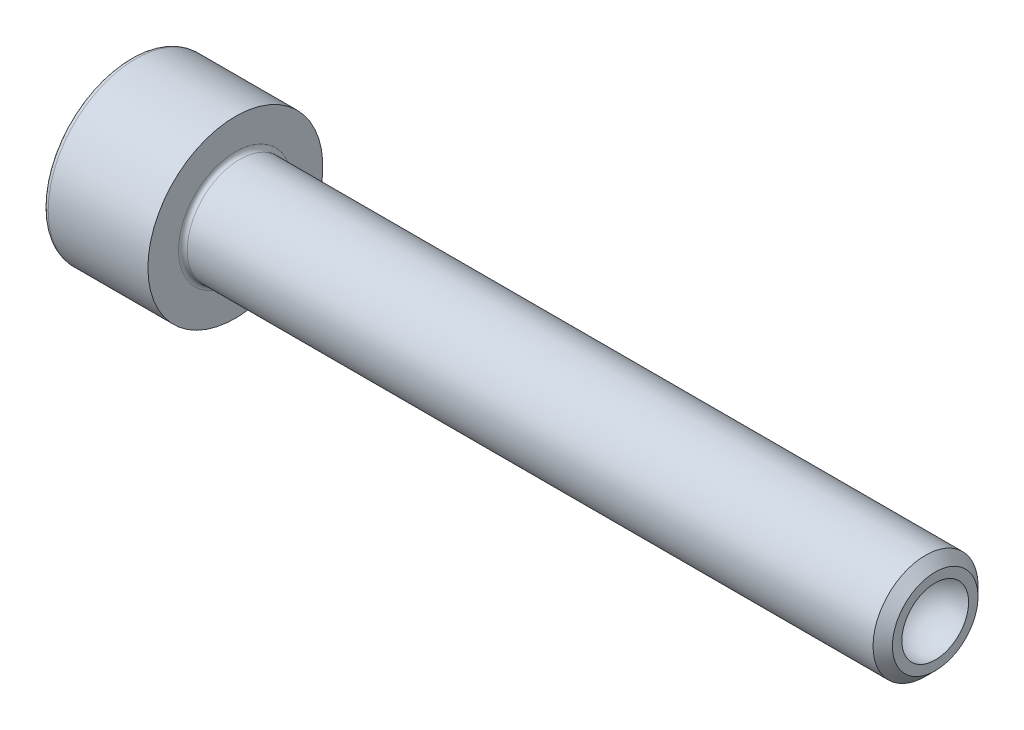
ISO-10303-21;
HEADER;
FILE_DESCRIPTION(('STEP AP214'),'2;1');
FILE_NAME('part.step','',(''),(''),'','','');
FILE_SCHEMA(('AUTOMOTIVE_DESIGN { 1 0 10303 214 1 1 1 1 }'));
ENDSEC;
DATA;
#1=APPLICATION_CONTEXT('core data for automotive mechanical design processes');
#2=APPLICATION_PROTOCOL_DEFINITION('international standard','automotive_design',2000,#1);
#3=PRODUCT_CONTEXT('',#1,'mechanical');
#4=PRODUCT('Part','Part','',(#3));
#5=PRODUCT_RELATED_PRODUCT_CATEGORY('part','',(#4));
#6=PRODUCT_DEFINITION_FORMATION('','',#4);
#7=PRODUCT_DEFINITION_CONTEXT('part definition',#1,'design');
#8=PRODUCT_DEFINITION('design','',#6,#7);
#9=PRODUCT_DEFINITION_SHAPE('','',#8);
#10=(LENGTH_UNIT() NAMED_UNIT(*) SI_UNIT(.MILLI.,.METRE.));
#11=(NAMED_UNIT(*) PLANE_ANGLE_UNIT() SI_UNIT($,.RADIAN.));
#12=(NAMED_UNIT(*) SI_UNIT($,.STERADIAN.) SOLID_ANGLE_UNIT());
#13=UNCERTAINTY_MEASURE_WITH_UNIT(LENGTH_MEASURE(1.E-05),#10,'distance_accuracy_value','');
#14=(GEOMETRIC_REPRESENTATION_CONTEXT(3) GLOBAL_UNCERTAINTY_ASSIGNED_CONTEXT((#13)) GLOBAL_UNIT_ASSIGNED_CONTEXT((#10,
#11,#12)) REPRESENTATION_CONTEXT('',''));
#15=CARTESIAN_POINT('',(0.,0.,0.));
#16=DIRECTION('',(0.,0.,1.));
#17=DIRECTION('',(1.,0.,0.));
#18=AXIS2_PLACEMENT_3D('',#15,#16,#17);
#19=CARTESIAN_POINT('',(0.,0.,0.));
#20=DIRECTION('',(-1.,0.,0.));
#21=DIRECTION('',(0.,0.,1.));
#22=AXIS2_PLACEMENT_3D('',#19,#20,#21);
#23=PLANE('',#22);
#24=DIRECTION('',(0.,-0.499999999999999,0.866025403784439));
#25=VECTOR('',#24,1.);
#26=CARTESIAN_POINT('',(0.,2.93524876856005,0.));
#27=LINE('',#26,#25);
#28=CARTESIAN_POINT('',(0.,2.93524876856005,0.));
#29=VERTEX_POINT('',#28);
#30=CARTESIAN_POINT('',(0.,1.46762438428003,2.542));
#31=VERTEX_POINT('',#30);
#32=EDGE_CURVE('E223',#29,#31,#27,.T.);
#33=ORIENTED_EDGE('',*,*,#32,.T.);
#34=DIRECTION('',(0.,1.,0.));
#35=VECTOR('',#34,1.);
#36=CARTESIAN_POINT('',(0.,-1.46762438428003,2.542));
#37=LINE('',#36,#35);
#38=CARTESIAN_POINT('',(0.,-1.46762438428003,2.542));
#39=VERTEX_POINT('',#38);
#40=EDGE_CURVE('E123',#39,#31,#37,.T.);
#41=ORIENTED_EDGE('',*,*,#40,.F.);
#42=DIRECTION('',(0.,-0.500000000000001,-0.866025403784438));
#43=VECTOR('',#42,1.);
#44=CARTESIAN_POINT('',(0.,-1.46762438428003,2.542));
#45=LINE('',#44,#43);
#46=CARTESIAN_POINT('',(0.,-2.93524876856006,0.));
#47=VERTEX_POINT('',#46);
#48=EDGE_CURVE('E245',#39,#47,#45,.T.);
#49=ORIENTED_EDGE('',*,*,#48,.T.);
#50=DIRECTION('',(0.,0.499999999999999,-0.866025403784439));
#51=VECTOR('',#50,1.);
#52=CARTESIAN_POINT('',(0.,-2.93524876856006,0.));
#53=LINE('',#52,#51);
#54=CARTESIAN_POINT('',(0.,-1.46762438428004,-2.542));
#55=VERTEX_POINT('',#54);
#56=EDGE_CURVE('E248',#47,#55,#53,.T.);
#57=ORIENTED_EDGE('',*,*,#56,.T.);
#58=DIRECTION('',(0.,-1.,0.));
#59=VECTOR('',#58,1.);
#60=CARTESIAN_POINT('',(0.,1.46762438428002,-2.542));
#61=LINE('',#60,#59);
#62=CARTESIAN_POINT('',(0.,1.46762438428002,-2.542));
#63=VERTEX_POINT('',#62);
#64=EDGE_CURVE('E251',#63,#55,#61,.T.);
#65=ORIENTED_EDGE('',*,*,#64,.F.);
#66=DIRECTION('',(0.,-0.500000000000001,-0.866025403784438));
#67=VECTOR('',#66,1.);
#68=CARTESIAN_POINT('',(0.,2.93524876856005,0.));
#69=LINE('',#68,#67);
#70=EDGE_CURVE('E118',#29,#63,#69,.T.);
#71=ORIENTED_EDGE('',*,*,#70,.F.);
#72=EDGE_LOOP('',(#33,#41,#49,#57,#65,#71));
#73=FACE_BOUND('',#72,.T.);
#74=CARTESIAN_POINT('',(0.,0.,0.));
#75=DIRECTION('',(-1.,0.,0.));
#76=DIRECTION('',(0.,0.,1.));
#77=AXIS2_PLACEMENT_3D('',#74,#75,#76);
#78=CIRCLE('',#77,4.7);
#79=CARTESIAN_POINT('',(0.,0.,4.7));
#80=VERTEX_POINT('',#79);
#81=EDGE_CURVE('E39',#80,#80,#78,.T.);
#82=ORIENTED_EDGE('',*,*,#81,.T.);
#83=EDGE_LOOP('',(#82));
#84=FACE_BOUND('',#83,.T.);
#85=ADVANCED_FACE('F31',(#73,#84),#23,.T.);
#86=CARTESIAN_POINT('',(-31.75,0.,0.));
#87=DIRECTION('',(-1.,0.,0.));
#88=DIRECTION('',(0.,0.,1.));
#89=AXIS2_PLACEMENT_3D('',#86,#87,#88);
#90=CYLINDRICAL_SURFACE('',#89,5.);
#91=CARTESIAN_POINT('',(0.300000000000002,0.,0.));
#92=DIRECTION('',(-1.,0.,0.));
#93=DIRECTION('',(0.,0.,1.));
#94=AXIS2_PLACEMENT_3D('',#91,#92,#93);
#95=CIRCLE('',#94,5.);
#96=CARTESIAN_POINT('',(0.300000000000002,0.,5.));
#97=VERTEX_POINT('',#96);
#98=EDGE_CURVE('E11',#97,#97,#95,.F.);
#99=ORIENTED_EDGE('',*,*,#98,.T.);
#100=EDGE_LOOP('',(#99));
#101=FACE_BOUND('',#100,.T.);
#102=CARTESIAN_POINT('',(6.,0.,0.));
#103=DIRECTION('',(-1.,0.,0.));
#104=DIRECTION('',(0.,0.,1.));
#105=AXIS2_PLACEMENT_3D('',#102,#103,#104);
#106=CIRCLE('',#105,5.);
#107=CARTESIAN_POINT('',(6.,0.,5.));
#108=VERTEX_POINT('',#107);
#109=EDGE_CURVE('E141',#108,#108,#106,.T.);
#110=ORIENTED_EDGE('',*,*,#109,.T.);
#111=EDGE_LOOP('',(#110));
#112=FACE_BOUND('',#111,.T.);
#113=ADVANCED_FACE('F165',(#101,#112),#90,.T.);
#114=CARTESIAN_POINT('',(6.,5.,0.));
#115=DIRECTION('',(1.,0.,0.));
#116=DIRECTION('',(0.,0.,-1.));
#117=AXIS2_PLACEMENT_3D('',#114,#115,#116);
#118=PLANE('',#117);
#119=CARTESIAN_POINT('',(6.,0.,0.));
#120=DIRECTION('',(1.,0.,0.));
#121=DIRECTION('',(0.,0.,-1.));
#122=AXIS2_PLACEMENT_3D('',#119,#120,#121);
#123=CIRCLE('',#122,3.25);
#124=CARTESIAN_POINT('',(6.,0.,-3.25));
#125=VERTEX_POINT('',#124);
#126=EDGE_CURVE('E144',#125,#125,#123,.F.);
#127=ORIENTED_EDGE('',*,*,#126,.T.);
#128=EDGE_LOOP('',(#127));
#129=FACE_BOUND('',#128,.T.);
#130=ORIENTED_EDGE('',*,*,#109,.F.);
#131=EDGE_LOOP('',(#130));
#132=FACE_BOUND('',#131,.T.);
#133=ADVANCED_FACE('F171',(#129,#132),#118,.T.);
#134=CARTESIAN_POINT('',(-31.75,0.,0.));
#135=DIRECTION('',(-1.,0.,0.));
#136=DIRECTION('',(0.,0.,1.));
#137=AXIS2_PLACEMENT_3D('',#134,#135,#136);
#138=CYLINDRICAL_SURFACE('',#137,3.);
#139=CARTESIAN_POINT('',(6.25,0.,0.));
#140=DIRECTION('',(1.,0.,0.));
#141=DIRECTION('',(0.,0.,-1.));
#142=AXIS2_PLACEMENT_3D('',#139,#140,#141);
#143=CIRCLE('',#142,3.);
#144=CARTESIAN_POINT('',(6.25,0.,-3.));
#145=VERTEX_POINT('',#144);
#146=EDGE_CURVE('E147',#145,#145,#143,.T.);
#147=ORIENTED_EDGE('',*,*,#146,.T.);
#148=EDGE_LOOP('',(#147));
#149=FACE_BOUND('',#148,.T.);
#150=CARTESIAN_POINT('',(45.4455,0.,0.));
#151=DIRECTION('',(-1.,0.,0.));
#152=DIRECTION('',(0.,0.,1.));
#153=AXIS2_PLACEMENT_3D('',#150,#151,#152);
#154=CIRCLE('',#153,3.);
#155=CARTESIAN_POINT('',(45.4455,0.,3.));
#156=VERTEX_POINT('',#155);
#157=EDGE_CURVE('E138',#156,#156,#154,.T.);
#158=ORIENTED_EDGE('',*,*,#157,.T.);
#159=EDGE_LOOP('',(#158));
#160=FACE_BOUND('',#159,.T.);
#161=ADVANCED_FACE('F177',(#149,#160),#138,.T.);
#162=CARTESIAN_POINT('',(46.,0.,0.));
#163=DIRECTION('',(-1.,0.,0.));
#164=DIRECTION('',(0.,0.,1.));
#165=AXIS2_PLACEMENT_3D('',#162,#163,#164);
#166=CONICAL_SURFACE('',#165,2.4455,0.785398163397461);
#167=ORIENTED_EDGE('',*,*,#157,.F.);
#168=EDGE_LOOP('',(#167));
#169=FACE_BOUND('',#168,.T.);
#170=CARTESIAN_POINT('',(46.,0.,0.));
#171=DIRECTION('',(-1.,0.,0.));
#172=DIRECTION('',(0.,0.,1.));
#173=AXIS2_PLACEMENT_3D('',#170,#171,#172);
#174=CIRCLE('',#173,2.4455);
#175=CARTESIAN_POINT('',(46.,0.,2.4455));
#176=VERTEX_POINT('',#175);
#177=EDGE_CURVE('E134',#176,#176,#174,.T.);
#178=ORIENTED_EDGE('',*,*,#177,.T.);
#179=EDGE_LOOP('',(#178));
#180=FACE_BOUND('',#179,.T.);
#181=ADVANCED_FACE('F181',(#169,#180),#166,.T.);
#182=CARTESIAN_POINT('',(46.,2.4455,0.));
#183=DIRECTION('',(1.,0.,0.));
#184=DIRECTION('',(0.,0.,-1.));
#185=AXIS2_PLACEMENT_3D('',#182,#183,#184);
#186=PLANE('',#185);
#187=CARTESIAN_POINT('',(46.,0.,0.));
#188=DIRECTION('',(-1.,0.,0.));
#189=DIRECTION('',(0.,-1.,0.));
#190=AXIS2_PLACEMENT_3D('',#187,#188,#189);
#191=CIRCLE('',#190,1.90787840283389);
#192=CARTESIAN_POINT('',(46.,-1.90787840283389,0.));
#193=VERTEX_POINT('',#192);
#194=EDGE_CURVE('E222',#193,#193,#191,.T.);
#195=ORIENTED_EDGE('',*,*,#194,.T.);
#196=EDGE_LOOP('',(#195));
#197=FACE_BOUND('',#196,.T.);
#198=ORIENTED_EDGE('',*,*,#177,.F.);
#199=EDGE_LOOP('',(#198));
#200=FACE_BOUND('',#199,.T.);
#201=ADVANCED_FACE('F161',(#197,#200),#186,.T.);
#202=CARTESIAN_POINT('',(6.25,0.,0.));
#203=DIRECTION('',(1.,0.,0.));
#204=DIRECTION('',(0.,0.,-1.));
#205=AXIS2_PLACEMENT_3D('',#202,#203,#204);
#206=TOROIDAL_SURFACE('',#205,3.25,0.25);
#207=ORIENTED_EDGE('',*,*,#146,.F.);
#208=EDGE_LOOP('',(#207));
#209=FACE_BOUND('',#208,.T.);
#210=ORIENTED_EDGE('',*,*,#126,.F.);
#211=EDGE_LOOP('',(#210));
#212=FACE_BOUND('',#211,.T.);
#213=ADVANCED_FACE('F154',(#209,#212),#206,.F.);
#214=CARTESIAN_POINT('',(0.300000000000002,0.,0.));
#215=DIRECTION('',(-1.,0.,0.));
#216=DIRECTION('',(0.,0.,1.));
#217=AXIS2_PLACEMENT_3D('',#214,#215,#216);
#218=TOROIDAL_SURFACE('',#217,4.7,0.3);
#219=ORIENTED_EDGE('',*,*,#98,.F.);
#220=EDGE_LOOP('',(#219));
#221=FACE_BOUND('',#220,.T.);
#222=ORIENTED_EDGE('',*,*,#81,.F.);
#223=EDGE_LOOP('',(#222));
#224=FACE_BOUND('',#223,.T.);
#225=ADVANCED_FACE('F33',(#221,#224),#218,.T.);
#226=CARTESIAN_POINT('',(3.,2.93524876856005,0.));
#227=DIRECTION('',(0.,-0.866025403784439,-0.499999999999999));
#228=DIRECTION('',(0.,0.499999999999999,-0.866025403784439));
#229=AXIS2_PLACEMENT_3D('',#226,#227,#228);
#230=PLANE('',#229);
#231=ORIENTED_EDGE('',*,*,#32,.F.);
#232=DIRECTION('',(-1.,0.,0.));
#233=VECTOR('',#232,1.);
#234=CARTESIAN_POINT('',(3.,2.93524876856005,0.));
#235=LINE('',#234,#233);
#236=CARTESIAN_POINT('',(3.,2.93524876856005,0.));
#237=VERTEX_POINT('',#236);
#238=EDGE_CURVE('E242',#237,#29,#235,.T.);
#239=ORIENTED_EDGE('',*,*,#238,.F.);
#240=DIRECTION('',(0.,-0.499999999999999,0.866025403784439));
#241=VECTOR('',#240,1.);
#242=CARTESIAN_POINT('',(3.,2.93524876856005,0.));
#243=LINE('',#242,#241);
#244=CARTESIAN_POINT('',(3.,2.20143657642004,1.271));
#245=VERTEX_POINT('',#244);
#246=EDGE_CURVE('E46',#237,#245,#243,.T.);
#247=ORIENTED_EDGE('',*,*,#246,.T.);
#248=CARTESIAN_POINT('',(3.,1.46762438428003,2.542));
#249=VERTEX_POINT('',#248);
#250=EDGE_CURVE('E104',#245,#249,#243,.T.);
#251=ORIENTED_EDGE('',*,*,#250,.T.);
#252=DIRECTION('',(-1.,0.,0.));
#253=VECTOR('',#252,1.);
#254=CARTESIAN_POINT('',(3.,1.46762438428003,2.542));
#255=LINE('',#254,#253);
#256=EDGE_CURVE('E116',#249,#31,#255,.T.);
#257=ORIENTED_EDGE('',*,*,#256,.T.);
#258=EDGE_LOOP('',(#231,#239,#247,#251,#257));
#259=FACE_BOUND('',#258,.T.);
#260=ADVANCED_FACE('F115',(#259),#230,.T.);
#261=CARTESIAN_POINT('',(3.,-1.46762438428003,2.542));
#262=DIRECTION('',(0.,0.,1.));
#263=DIRECTION('',(0.,-1.,0.));
#264=AXIS2_PLACEMENT_3D('',#261,#262,#263);
#265=PLANE('',#264);
#266=ORIENTED_EDGE('',*,*,#40,.T.);
#267=ORIENTED_EDGE('',*,*,#256,.F.);
#268=DIRECTION('',(0.,1.,0.));
#269=VECTOR('',#268,1.);
#270=CARTESIAN_POINT('',(3.,-1.46762438428003,2.542));
#271=LINE('',#270,#269);
#272=CARTESIAN_POINT('',(3.,0.,2.542));
#273=VERTEX_POINT('',#272);
#274=EDGE_CURVE('E102',#273,#249,#271,.T.);
#275=ORIENTED_EDGE('',*,*,#274,.F.);
#276=CARTESIAN_POINT('',(3.,-1.46762438428003,2.542));
#277=VERTEX_POINT('',#276);
#278=EDGE_CURVE('E112',#277,#273,#271,.T.);
#279=ORIENTED_EDGE('',*,*,#278,.F.);
#280=DIRECTION('',(-1.,0.,0.));
#281=VECTOR('',#280,1.);
#282=CARTESIAN_POINT('',(3.,-1.46762438428003,2.542));
#283=LINE('',#282,#281);
#284=EDGE_CURVE('E125',#277,#39,#283,.T.);
#285=ORIENTED_EDGE('',*,*,#284,.T.);
#286=EDGE_LOOP('',(#266,#267,#275,#279,#285));
#287=FACE_BOUND('',#286,.T.);
#288=ADVANCED_FACE('F120',(#287),#265,.F.);
#289=CARTESIAN_POINT('',(3.,-1.46762438428003,2.542));
#290=DIRECTION('',(0.,0.866025403784438,-0.500000000000001));
#291=DIRECTION('',(0.,0.500000000000001,0.866025403784438));
#292=AXIS2_PLACEMENT_3D('',#289,#290,#291);
#293=PLANE('',#292);
#294=ORIENTED_EDGE('',*,*,#48,.F.);
#295=ORIENTED_EDGE('',*,*,#284,.F.);
#296=DIRECTION('',(0.,-0.500000000000001,-0.866025403784438));
#297=VECTOR('',#296,1.);
#298=CARTESIAN_POINT('',(3.,-1.46762438428003,2.542));
#299=LINE('',#298,#297);
#300=CARTESIAN_POINT('',(3.,-2.20143657642004,1.271));
#301=VERTEX_POINT('',#300);
#302=EDGE_CURVE('E228',#277,#301,#299,.T.);
#303=ORIENTED_EDGE('',*,*,#302,.T.);
#304=CARTESIAN_POINT('',(3.,-2.93524876856006,0.));
#305=VERTEX_POINT('',#304);
#306=EDGE_CURVE('E227',#301,#305,#299,.T.);
#307=ORIENTED_EDGE('',*,*,#306,.T.);
#308=DIRECTION('',(-1.,0.,0.));
#309=VECTOR('',#308,1.);
#310=CARTESIAN_POINT('',(3.,-2.93524876856006,0.));
#311=LINE('',#310,#309);
#312=EDGE_CURVE('E130',#305,#47,#311,.T.);
#313=ORIENTED_EDGE('',*,*,#312,.T.);
#314=EDGE_LOOP('',(#294,#295,#303,#307,#313));
#315=FACE_BOUND('',#314,.T.);
#316=ADVANCED_FACE('F195',(#315),#293,.T.);
#317=CARTESIAN_POINT('',(3.,-2.93524876856006,0.));
#318=DIRECTION('',(0.,0.866025403784439,0.499999999999999));
#319=DIRECTION('',(0.,-0.499999999999999,0.866025403784439));
#320=AXIS2_PLACEMENT_3D('',#317,#318,#319);
#321=PLANE('',#320);
#322=ORIENTED_EDGE('',*,*,#56,.F.);
#323=ORIENTED_EDGE('',*,*,#312,.F.);
#324=DIRECTION('',(0.,0.499999999999999,-0.866025403784439));
#325=VECTOR('',#324,1.);
#326=CARTESIAN_POINT('',(3.,-2.93524876856006,0.));
#327=LINE('',#326,#325);
#328=CARTESIAN_POINT('',(3.,-2.20143657642005,-1.271));
#329=VERTEX_POINT('',#328);
#330=EDGE_CURVE('E232',#305,#329,#327,.T.);
#331=ORIENTED_EDGE('',*,*,#330,.T.);
#332=CARTESIAN_POINT('',(3.,-1.46762438428004,-2.542));
#333=VERTEX_POINT('',#332);
#334=EDGE_CURVE('E231',#329,#333,#327,.T.);
#335=ORIENTED_EDGE('',*,*,#334,.T.);
#336=DIRECTION('',(-1.,0.,0.));
#337=VECTOR('',#336,1.);
#338=CARTESIAN_POINT('',(3.,-1.46762438428004,-2.542));
#339=LINE('',#338,#337);
#340=EDGE_CURVE('E260',#333,#55,#339,.T.);
#341=ORIENTED_EDGE('',*,*,#340,.T.);
#342=EDGE_LOOP('',(#322,#323,#331,#335,#341));
#343=FACE_BOUND('',#342,.T.);
#344=ADVANCED_FACE('F198',(#343),#321,.T.);
#345=CARTESIAN_POINT('',(3.,1.46762438428002,-2.542));
#346=DIRECTION('',(0.,0.,-1.));
#347=DIRECTION('',(0.,1.,0.));
#348=AXIS2_PLACEMENT_3D('',#345,#346,#347);
#349=PLANE('',#348);
#350=ORIENTED_EDGE('',*,*,#64,.T.);
#351=ORIENTED_EDGE('',*,*,#340,.F.);
#352=DIRECTION('',(0.,-1.,0.));
#353=VECTOR('',#352,1.);
#354=CARTESIAN_POINT('',(3.,1.46762438428002,-2.542));
#355=LINE('',#354,#353);
#356=CARTESIAN_POINT('',(3.,0.,-2.542));
#357=VERTEX_POINT('',#356);
#358=EDGE_CURVE('E235',#357,#333,#355,.T.);
#359=ORIENTED_EDGE('',*,*,#358,.F.);
#360=CARTESIAN_POINT('',(3.,1.46762438428002,-2.542));
#361=VERTEX_POINT('',#360);
#362=EDGE_CURVE('E236',#361,#357,#355,.T.);
#363=ORIENTED_EDGE('',*,*,#362,.F.);
#364=DIRECTION('',(-1.,0.,0.));
#365=VECTOR('',#364,1.);
#366=CARTESIAN_POINT('',(3.,1.46762438428002,-2.542));
#367=LINE('',#366,#365);
#368=EDGE_CURVE('E257',#361,#63,#367,.T.);
#369=ORIENTED_EDGE('',*,*,#368,.T.);
#370=EDGE_LOOP('',(#350,#351,#359,#363,#369));
#371=FACE_BOUND('',#370,.T.);
#372=ADVANCED_FACE('F202',(#371),#349,.F.);
#373=CARTESIAN_POINT('',(3.,2.93524876856005,0.));
#374=DIRECTION('',(0.,0.866025403784438,-0.500000000000001));
#375=DIRECTION('',(0.,0.500000000000001,0.866025403784438));
#376=AXIS2_PLACEMENT_3D('',#373,#374,#375);
#377=PLANE('',#376);
#378=ORIENTED_EDGE('',*,*,#70,.T.);
#379=ORIENTED_EDGE('',*,*,#368,.F.);
#380=DIRECTION('',(0.,-0.500000000000001,-0.866025403784438));
#381=VECTOR('',#380,1.);
#382=CARTESIAN_POINT('',(3.,2.93524876856005,0.));
#383=LINE('',#382,#381);
#384=CARTESIAN_POINT('',(3.,2.20143657642004,-1.271));
#385=VERTEX_POINT('',#384);
#386=EDGE_CURVE('E239',#385,#361,#383,.T.);
#387=ORIENTED_EDGE('',*,*,#386,.F.);
#388=EDGE_CURVE('E240',#237,#385,#383,.T.);
#389=ORIENTED_EDGE('',*,*,#388,.F.);
#390=ORIENTED_EDGE('',*,*,#238,.T.);
#391=EDGE_LOOP('',(#378,#379,#387,#389,#390));
#392=FACE_BOUND('',#391,.T.);
#393=ADVANCED_FACE('F206',(#392),#377,.F.);
#394=CARTESIAN_POINT('',(3.,1.46762438428003,2.542));
#395=DIRECTION('',(-1.,0.,0.));
#396=DIRECTION('',(0.,0.,1.));
#397=AXIS2_PLACEMENT_3D('',#394,#395,#396);
#398=PLANE('',#397);
#399=CARTESIAN_POINT('',(3.,0.,0.));
#400=DIRECTION('',(-1.,0.,0.));
#401=DIRECTION('',(0.,0.,1.));
#402=AXIS2_PLACEMENT_3D('',#399,#400,#401);
#403=CIRCLE('',#402,2.542);
#404=EDGE_CURVE('E124',#301,#273,#403,.T.);
#405=ORIENTED_EDGE('',*,*,#404,.F.);
#406=ORIENTED_EDGE('',*,*,#302,.F.);
#407=ORIENTED_EDGE('',*,*,#278,.T.);
#408=EDGE_LOOP('',(#405,#406,#407));
#409=FACE_BOUND('',#408,.T.);
#410=ADVANCED_FACE('F210',(#409),#398,.T.);
#411=EDGE_CURVE('E128',#329,#301,#403,.T.);
#412=ORIENTED_EDGE('',*,*,#411,.F.);
#413=ORIENTED_EDGE('',*,*,#330,.F.);
#414=ORIENTED_EDGE('',*,*,#306,.F.);
#415=EDGE_LOOP('',(#412,#413,#414));
#416=FACE_BOUND('',#415,.T.);
#417=ADVANCED_FACE('F214',(#416),#398,.T.);
#418=EDGE_CURVE('E280',#357,#329,#403,.T.);
#419=ORIENTED_EDGE('',*,*,#418,.F.);
#420=ORIENTED_EDGE('',*,*,#358,.T.);
#421=ORIENTED_EDGE('',*,*,#334,.F.);
#422=EDGE_LOOP('',(#419,#420,#421));
#423=FACE_BOUND('',#422,.T.);
#424=ADVANCED_FACE('F286',(#423),#398,.T.);
#425=EDGE_CURVE('E277',#385,#357,#403,.T.);
#426=ORIENTED_EDGE('',*,*,#425,.F.);
#427=ORIENTED_EDGE('',*,*,#386,.T.);
#428=ORIENTED_EDGE('',*,*,#362,.T.);
#429=EDGE_LOOP('',(#426,#427,#428));
#430=FACE_BOUND('',#429,.T.);
#431=ADVANCED_FACE('F275',(#430),#398,.T.);
#432=EDGE_CURVE('E135',#245,#385,#403,.T.);
#433=ORIENTED_EDGE('',*,*,#432,.F.);
#434=ORIENTED_EDGE('',*,*,#246,.F.);
#435=ORIENTED_EDGE('',*,*,#388,.T.);
#436=EDGE_LOOP('',(#433,#434,#435));
#437=FACE_BOUND('',#436,.T.);
#438=ADVANCED_FACE('F269',(#437),#398,.T.);
#439=EDGE_CURVE('E107',#273,#245,#403,.T.);
#440=ORIENTED_EDGE('',*,*,#439,.F.);
#441=ORIENTED_EDGE('',*,*,#274,.T.);
#442=ORIENTED_EDGE('',*,*,#250,.F.);
#443=EDGE_LOOP('',(#440,#441,#442));
#444=FACE_BOUND('',#443,.T.);
#445=ADVANCED_FACE('F103',(#444),#398,.T.);
#446=CARTESIAN_POINT('',(3.,0.,0.));
#447=DIRECTION('',(-1.,0.,0.));
#448=DIRECTION('',(0.,0.,1.));
#449=AXIS2_PLACEMENT_3D('',#446,#447,#448);
#450=CONICAL_SURFACE('',#449,2.542,1.04719755119659);
#451=CARTESIAN_POINT('',(4.46762438428005,0.,0.));
#452=VERTEX_POINT('',#451);
#453=VERTEX_LOOP('',#452);
#454=FACE_BOUND('',#453,.T.);
#455=ORIENTED_EDGE('',*,*,#439,.T.);
#456=ORIENTED_EDGE('',*,*,#432,.T.);
#457=ORIENTED_EDGE('',*,*,#425,.T.);
#458=ORIENTED_EDGE('',*,*,#418,.T.);
#459=ORIENTED_EDGE('',*,*,#411,.T.);
#460=ORIENTED_EDGE('',*,*,#404,.T.);
#461=EDGE_LOOP('',(#455,#456,#457,#458,#459,#460));
#462=FACE_BOUND('',#461,.T.);
#463=ADVANCED_FACE('F189',(#454,#462),#450,.F.);
#464=CARTESIAN_POINT('',(45.4,0.,0.));
#465=DIRECTION('',(-1.,0.,0.));
#466=DIRECTION('',(0.,1.,0.));
#467=AXIS2_PLACEMENT_3D('',#464,#465,#466);
#468=SPHERICAL_SURFACE('',#467,2.);
#469=ORIENTED_EDGE('',*,*,#194,.F.);
#470=EDGE_LOOP('',(#469));
#471=FACE_BOUND('',#470,.T.);
#472=ADVANCED_FACE('F191',(#471),#468,.F.);
#473=CLOSED_SHELL('',(#85,#113,#133,#161,#181,#201,#213,#225,#260,#288,#316,#344,#372,#393,#410,
#417,#424,#431,#438,#445,#463,#472));
#474=MANIFOLD_SOLID_BREP('B2',#473);
#475=ADVANCED_BREP_SHAPE_REPRESENTATION('',(#18,#474),#14);
#476=SHAPE_DEFINITION_REPRESENTATION(#9,#475);
ENDSEC;
END-ISO-10303-21;
